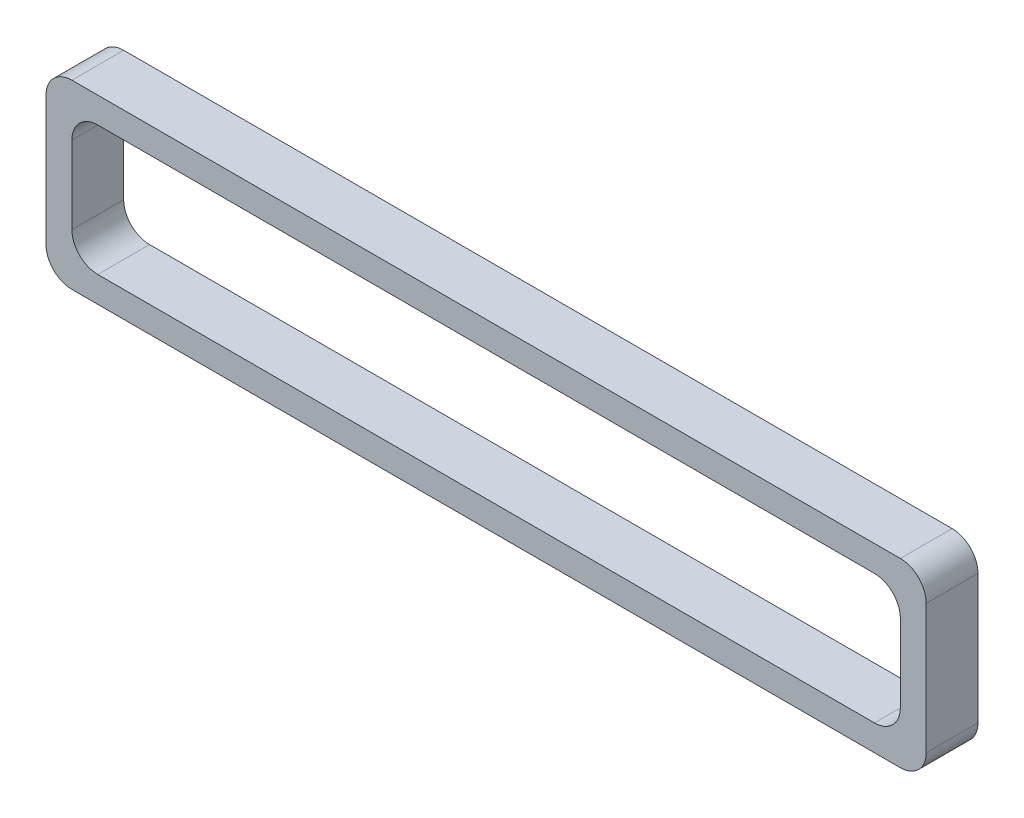
ISO-10303-21;
HEADER;
FILE_DESCRIPTION(('STEP AP214'),'2;1');
FILE_NAME('part.step','',(''),(''),'','','');
FILE_SCHEMA(('AUTOMOTIVE_DESIGN { 1 0 10303 214 1 1 1 1 }'));
ENDSEC;
DATA;
#1=APPLICATION_CONTEXT('core data for automotive mechanical design processes');
#2=APPLICATION_PROTOCOL_DEFINITION('international standard','automotive_design',2000,#1);
#3=PRODUCT_CONTEXT('',#1,'mechanical');
#4=PRODUCT('Part','Part','',(#3));
#5=PRODUCT_RELATED_PRODUCT_CATEGORY('part','',(#4));
#6=PRODUCT_DEFINITION_FORMATION('','',#4);
#7=PRODUCT_DEFINITION_CONTEXT('part definition',#1,'design');
#8=PRODUCT_DEFINITION('design','',#6,#7);
#9=PRODUCT_DEFINITION_SHAPE('','',#8);
#10=(LENGTH_UNIT() NAMED_UNIT(*) SI_UNIT(.MILLI.,.METRE.));
#11=(NAMED_UNIT(*) PLANE_ANGLE_UNIT() SI_UNIT($,.RADIAN.));
#12=(NAMED_UNIT(*) SI_UNIT($,.STERADIAN.) SOLID_ANGLE_UNIT());
#13=UNCERTAINTY_MEASURE_WITH_UNIT(LENGTH_MEASURE(1.E-05),#10,'distance_accuracy_value','');
#14=(GEOMETRIC_REPRESENTATION_CONTEXT(3) GLOBAL_UNCERTAINTY_ASSIGNED_CONTEXT((#13)) GLOBAL_UNIT_ASSIGNED_CONTEXT((#10,
#11,#12)) REPRESENTATION_CONTEXT('',''));
#15=CARTESIAN_POINT('',(0.,0.,0.));
#16=DIRECTION('',(0.,0.,1.));
#17=DIRECTION('',(1.,0.,0.));
#18=AXIS2_PLACEMENT_3D('',#15,#16,#17);
#19=CARTESIAN_POINT('',(16.,-2.5,2.));
#20=DIRECTION('',(0.,0.,1.));
#21=DIRECTION('',(1.,0.,0.));
#22=AXIS2_PLACEMENT_3D('',#19,#20,#21);
#23=PLANE('',#22);
#24=CARTESIAN_POINT('',(16.,-2.5,2.));
#25=DIRECTION('',(0.,0.,1.));
#26=DIRECTION('',(1.,0.,0.));
#27=AXIS2_PLACEMENT_3D('',#24,#25,#26);
#28=CIRCLE('',#27,0.999999999999999);
#29=CARTESIAN_POINT('',(16.,-3.5,2.));
#30=VERTEX_POINT('',#29);
#31=CARTESIAN_POINT('',(17.,-2.5,2.));
#32=VERTEX_POINT('',#31);
#33=EDGE_CURVE('E211',#30,#32,#28,.T.);
#34=ORIENTED_EDGE('',*,*,#33,.T.);
#35=DIRECTION('',(0.,1.,0.));
#36=VECTOR('',#35,1.);
#37=CARTESIAN_POINT('',(17.,2.5,2.));
#38=LINE('',#37,#36);
#39=CARTESIAN_POINT('',(17.,2.5,2.));
#40=VERTEX_POINT('',#39);
#41=EDGE_CURVE('E214',#32,#40,#38,.T.);
#42=ORIENTED_EDGE('',*,*,#41,.T.);
#43=CARTESIAN_POINT('',(16.,2.5,2.));
#44=DIRECTION('',(0.,0.,1.));
#45=DIRECTION('',(-1.,0.,0.));
#46=AXIS2_PLACEMENT_3D('',#43,#44,#45);
#47=CIRCLE('',#46,1.);
#48=CARTESIAN_POINT('',(16.,3.5,2.));
#49=VERTEX_POINT('',#48);
#50=EDGE_CURVE('E217',#40,#49,#47,.T.);
#51=ORIENTED_EDGE('',*,*,#50,.T.);
#52=DIRECTION('',(-1.,0.,0.));
#53=VECTOR('',#52,1.);
#54=CARTESIAN_POINT('',(-16.,3.5,2.));
#55=LINE('',#54,#53);
#56=CARTESIAN_POINT('',(-16.,3.5,2.));
#57=VERTEX_POINT('',#56);
#58=EDGE_CURVE('E219',#49,#57,#55,.T.);
#59=ORIENTED_EDGE('',*,*,#58,.T.);
#60=CARTESIAN_POINT('',(-16.,2.5,2.));
#61=DIRECTION('',(0.,0.,1.));
#62=DIRECTION('',(1.,0.,0.));
#63=AXIS2_PLACEMENT_3D('',#60,#61,#62);
#64=CIRCLE('',#63,1.);
#65=CARTESIAN_POINT('',(-17.,2.5,2.));
#66=VERTEX_POINT('',#65);
#67=EDGE_CURVE('E221',#57,#66,#64,.T.);
#68=ORIENTED_EDGE('',*,*,#67,.T.);
#69=DIRECTION('',(0.,-1.,0.));
#70=VECTOR('',#69,1.);
#71=CARTESIAN_POINT('',(-17.,2.5,2.));
#72=LINE('',#71,#70);
#73=CARTESIAN_POINT('',(-17.,-2.5,2.));
#74=VERTEX_POINT('',#73);
#75=EDGE_CURVE('E223',#66,#74,#72,.T.);
#76=ORIENTED_EDGE('',*,*,#75,.T.);
#77=CARTESIAN_POINT('',(-16.,-2.5,2.));
#78=DIRECTION('',(0.,0.,1.));
#79=DIRECTION('',(1.,0.,0.));
#80=AXIS2_PLACEMENT_3D('',#77,#78,#79);
#81=CIRCLE('',#80,1.);
#82=CARTESIAN_POINT('',(-16.,-3.5,2.));
#83=VERTEX_POINT('',#82);
#84=EDGE_CURVE('E225',#74,#83,#81,.T.);
#85=ORIENTED_EDGE('',*,*,#84,.T.);
#86=DIRECTION('',(1.,0.,0.));
#87=VECTOR('',#86,1.);
#88=CARTESIAN_POINT('',(-16.,-3.5,2.));
#89=LINE('',#88,#87);
#90=EDGE_CURVE('E227',#83,#30,#89,.T.);
#91=ORIENTED_EDGE('',*,*,#90,.T.);
#92=EDGE_LOOP('',(#34,#42,#51,#59,#68,#76,#85,#91));
#93=FACE_BOUND('',#92,.T.);
#94=DIRECTION('',(-1.,0.,0.));
#95=VECTOR('',#94,1.);
#96=CARTESIAN_POINT('',(-15.,2.5,2.));
#97=LINE('',#96,#95);
#98=CARTESIAN_POINT('',(15.,2.5,2.));
#99=VERTEX_POINT('',#98);
#100=CARTESIAN_POINT('',(-15.,2.5,2.));
#101=VERTEX_POINT('',#100);
#102=EDGE_CURVE('E154',#99,#101,#97,.T.);
#103=ORIENTED_EDGE('',*,*,#102,.F.);
#104=CARTESIAN_POINT('',(15.,1.5,2.));
#105=DIRECTION('',(0.,0.,1.));
#106=DIRECTION('',(-1.,0.,0.));
#107=AXIS2_PLACEMENT_3D('',#104,#105,#106);
#108=CIRCLE('',#107,1.);
#109=CARTESIAN_POINT('',(16.,1.5,2.));
#110=VERTEX_POINT('',#109);
#111=EDGE_CURVE('E146',#110,#99,#108,.T.);
#112=ORIENTED_EDGE('',*,*,#111,.F.);
#113=DIRECTION('',(0.,1.,0.));
#114=VECTOR('',#113,1.);
#115=CARTESIAN_POINT('',(16.,1.5,2.));
#116=LINE('',#115,#114);
#117=CARTESIAN_POINT('',(16.,-1.5,2.));
#118=VERTEX_POINT('',#117);
#119=EDGE_CURVE('E179',#118,#110,#116,.T.);
#120=ORIENTED_EDGE('',*,*,#119,.F.);
#121=CARTESIAN_POINT('',(15.,-1.5,2.));
#122=DIRECTION('',(0.,0.,1.));
#123=DIRECTION('',(1.,0.,0.));
#124=AXIS2_PLACEMENT_3D('',#121,#122,#123);
#125=CIRCLE('',#124,0.999999999999999);
#126=CARTESIAN_POINT('',(15.,-2.5,2.));
#127=VERTEX_POINT('',#126);
#128=EDGE_CURVE('E177',#127,#118,#125,.T.);
#129=ORIENTED_EDGE('',*,*,#128,.F.);
#130=DIRECTION('',(1.,0.,0.));
#131=VECTOR('',#130,1.);
#132=CARTESIAN_POINT('',(-15.,-2.5,2.));
#133=LINE('',#132,#131);
#134=CARTESIAN_POINT('',(-15.,-2.5,2.));
#135=VERTEX_POINT('',#134);
#136=EDGE_CURVE('E175',#135,#127,#133,.T.);
#137=ORIENTED_EDGE('',*,*,#136,.F.);
#138=CARTESIAN_POINT('',(-15.,-1.5,2.));
#139=DIRECTION('',(0.,0.,1.));
#140=DIRECTION('',(1.,0.,0.));
#141=AXIS2_PLACEMENT_3D('',#138,#139,#140);
#142=CIRCLE('',#141,0.999999999999999);
#143=CARTESIAN_POINT('',(-16.,-1.5,2.));
#144=VERTEX_POINT('',#143);
#145=EDGE_CURVE('E173',#144,#135,#142,.T.);
#146=ORIENTED_EDGE('',*,*,#145,.F.);
#147=DIRECTION('',(0.,-1.,0.));
#148=VECTOR('',#147,1.);
#149=CARTESIAN_POINT('',(-16.,1.5,2.));
#150=LINE('',#149,#148);
#151=CARTESIAN_POINT('',(-16.,1.5,2.));
#152=VERTEX_POINT('',#151);
#153=EDGE_CURVE('E169',#152,#144,#150,.T.);
#154=ORIENTED_EDGE('',*,*,#153,.F.);
#155=CARTESIAN_POINT('',(-15.,1.5,2.));
#156=DIRECTION('',(0.,0.,1.));
#157=DIRECTION('',(1.,0.,0.));
#158=AXIS2_PLACEMENT_3D('',#155,#156,#157);
#159=CIRCLE('',#158,1.);
#160=EDGE_CURVE('E167',#101,#152,#159,.T.);
#161=ORIENTED_EDGE('',*,*,#160,.F.);
#162=EDGE_LOOP('',(#103,#112,#120,#129,#137,#146,#154,#161));
#163=FACE_BOUND('',#162,.T.);
#164=ADVANCED_FACE('F33',(#93,#163),#23,.T.);
#165=CARTESIAN_POINT('',(16.,-2.5,0.));
#166=DIRECTION('',(0.,0.,1.));
#167=DIRECTION('',(1.,0.,0.));
#168=AXIS2_PLACEMENT_3D('',#165,#166,#167);
#169=PLANE('',#168);
#170=CARTESIAN_POINT('',(16.,-2.5,0.));
#171=DIRECTION('',(0.,0.,1.));
#172=DIRECTION('',(1.,0.,0.));
#173=AXIS2_PLACEMENT_3D('',#170,#171,#172);
#174=CIRCLE('',#173,0.999999999999999);
#175=CARTESIAN_POINT('',(16.,-3.5,0.));
#176=VERTEX_POINT('',#175);
#177=CARTESIAN_POINT('',(17.,-2.5,0.));
#178=VERTEX_POINT('',#177);
#179=EDGE_CURVE('E162',#176,#178,#174,.T.);
#180=ORIENTED_EDGE('',*,*,#179,.F.);
#181=DIRECTION('',(1.,0.,0.));
#182=VECTOR('',#181,1.);
#183=CARTESIAN_POINT('',(-16.,-3.5,0.));
#184=LINE('',#183,#182);
#185=CARTESIAN_POINT('',(-16.,-3.5,0.));
#186=VERTEX_POINT('',#185);
#187=EDGE_CURVE('E215',#186,#176,#184,.T.);
#188=ORIENTED_EDGE('',*,*,#187,.F.);
#189=CARTESIAN_POINT('',(-16.,-2.5,0.));
#190=DIRECTION('',(0.,0.,1.));
#191=DIRECTION('',(1.,0.,0.));
#192=AXIS2_PLACEMENT_3D('',#189,#190,#191);
#193=CIRCLE('',#192,1.);
#194=CARTESIAN_POINT('',(-17.,-2.5,0.));
#195=VERTEX_POINT('',#194);
#196=EDGE_CURVE('E242',#195,#186,#193,.T.);
#197=ORIENTED_EDGE('',*,*,#196,.F.);
#198=DIRECTION('',(0.,-1.,0.));
#199=VECTOR('',#198,1.);
#200=CARTESIAN_POINT('',(-17.,2.5,0.));
#201=LINE('',#200,#199);
#202=CARTESIAN_POINT('',(-17.,2.5,0.));
#203=VERTEX_POINT('',#202);
#204=EDGE_CURVE('E240',#203,#195,#201,.T.);
#205=ORIENTED_EDGE('',*,*,#204,.F.);
#206=CARTESIAN_POINT('',(-16.,2.5,0.));
#207=DIRECTION('',(0.,0.,1.));
#208=DIRECTION('',(1.,0.,0.));
#209=AXIS2_PLACEMENT_3D('',#206,#207,#208);
#210=CIRCLE('',#209,1.);
#211=CARTESIAN_POINT('',(-16.,3.5,0.));
#212=VERTEX_POINT('',#211);
#213=EDGE_CURVE('E238',#212,#203,#210,.T.);
#214=ORIENTED_EDGE('',*,*,#213,.F.);
#215=DIRECTION('',(-1.,0.,0.));
#216=VECTOR('',#215,1.);
#217=CARTESIAN_POINT('',(-16.,3.5,0.));
#218=LINE('',#217,#216);
#219=CARTESIAN_POINT('',(16.,3.5,0.));
#220=VERTEX_POINT('',#219);
#221=EDGE_CURVE('E236',#220,#212,#218,.T.);
#222=ORIENTED_EDGE('',*,*,#221,.F.);
#223=CARTESIAN_POINT('',(16.,2.5,0.));
#224=DIRECTION('',(0.,0.,1.));
#225=DIRECTION('',(-1.,0.,0.));
#226=AXIS2_PLACEMENT_3D('',#223,#224,#225);
#227=CIRCLE('',#226,1.);
#228=CARTESIAN_POINT('',(17.,2.5,0.));
#229=VERTEX_POINT('',#228);
#230=EDGE_CURVE('E234',#229,#220,#227,.T.);
#231=ORIENTED_EDGE('',*,*,#230,.F.);
#232=DIRECTION('',(0.,1.,0.));
#233=VECTOR('',#232,1.);
#234=CARTESIAN_POINT('',(17.,2.5,0.));
#235=LINE('',#234,#233);
#236=EDGE_CURVE('E232',#178,#229,#235,.T.);
#237=ORIENTED_EDGE('',*,*,#236,.F.);
#238=EDGE_LOOP('',(#180,#188,#197,#205,#214,#222,#231,#237));
#239=FACE_BOUND('',#238,.T.);
#240=CARTESIAN_POINT('',(15.,1.5,0.));
#241=DIRECTION('',(0.,0.,1.));
#242=DIRECTION('',(-1.,0.,0.));
#243=AXIS2_PLACEMENT_3D('',#240,#241,#242);
#244=CIRCLE('',#243,1.);
#245=CARTESIAN_POINT('',(16.,1.5,0.));
#246=VERTEX_POINT('',#245);
#247=CARTESIAN_POINT('',(15.,2.5,0.));
#248=VERTEX_POINT('',#247);
#249=EDGE_CURVE('E56',#246,#248,#244,.T.);
#250=ORIENTED_EDGE('',*,*,#249,.T.);
#251=DIRECTION('',(-1.,0.,0.));
#252=VECTOR('',#251,1.);
#253=CARTESIAN_POINT('',(-15.,2.5,0.));
#254=LINE('',#253,#252);
#255=CARTESIAN_POINT('',(-15.,2.5,0.));
#256=VERTEX_POINT('',#255);
#257=EDGE_CURVE('E161',#248,#256,#254,.T.);
#258=ORIENTED_EDGE('',*,*,#257,.T.);
#259=CARTESIAN_POINT('',(-15.,1.5,0.));
#260=DIRECTION('',(0.,0.,1.));
#261=DIRECTION('',(1.,0.,0.));
#262=AXIS2_PLACEMENT_3D('',#259,#260,#261);
#263=CIRCLE('',#262,1.);
#264=CARTESIAN_POINT('',(-16.,1.5,0.));
#265=VERTEX_POINT('',#264);
#266=EDGE_CURVE('E183',#256,#265,#263,.T.);
#267=ORIENTED_EDGE('',*,*,#266,.T.);
#268=DIRECTION('',(0.,-1.,0.));
#269=VECTOR('',#268,1.);
#270=CARTESIAN_POINT('',(-16.,1.5,0.));
#271=LINE('',#270,#269);
#272=CARTESIAN_POINT('',(-16.,-1.5,0.));
#273=VERTEX_POINT('',#272);
#274=EDGE_CURVE('E186',#265,#273,#271,.T.);
#275=ORIENTED_EDGE('',*,*,#274,.T.);
#276=CARTESIAN_POINT('',(-15.,-1.5,0.));
#277=DIRECTION('',(0.,0.,1.));
#278=DIRECTION('',(1.,0.,0.));
#279=AXIS2_PLACEMENT_3D('',#276,#277,#278);
#280=CIRCLE('',#279,0.999999999999999);
#281=CARTESIAN_POINT('',(-15.,-2.5,0.));
#282=VERTEX_POINT('',#281);
#283=EDGE_CURVE('E189',#273,#282,#280,.T.);
#284=ORIENTED_EDGE('',*,*,#283,.T.);
#285=DIRECTION('',(1.,0.,0.));
#286=VECTOR('',#285,1.);
#287=CARTESIAN_POINT('',(-15.,-2.5,0.));
#288=LINE('',#287,#286);
#289=CARTESIAN_POINT('',(15.,-2.5,0.));
#290=VERTEX_POINT('',#289);
#291=EDGE_CURVE('E192',#282,#290,#288,.T.);
#292=ORIENTED_EDGE('',*,*,#291,.T.);
#293=CARTESIAN_POINT('',(15.,-1.5,0.));
#294=DIRECTION('',(0.,0.,1.));
#295=DIRECTION('',(1.,0.,0.));
#296=AXIS2_PLACEMENT_3D('',#293,#294,#295);
#297=CIRCLE('',#296,0.999999999999999);
#298=CARTESIAN_POINT('',(16.,-1.5,0.));
#299=VERTEX_POINT('',#298);
#300=EDGE_CURVE('E195',#290,#299,#297,.T.);
#301=ORIENTED_EDGE('',*,*,#300,.T.);
#302=DIRECTION('',(0.,1.,0.));
#303=VECTOR('',#302,1.);
#304=CARTESIAN_POINT('',(16.,1.5,0.));
#305=LINE('',#304,#303);
#306=EDGE_CURVE('E155',#299,#246,#305,.T.);
#307=ORIENTED_EDGE('',*,*,#306,.T.);
#308=EDGE_LOOP('',(#250,#258,#267,#275,#284,#292,#301,#307));
#309=FACE_BOUND('',#308,.T.);
#310=ADVANCED_FACE('F272',(#239,#309),#169,.F.);
#311=CARTESIAN_POINT('',(16.,-2.5,2.));
#312=DIRECTION('',(0.,0.,-1.));
#313=DIRECTION('',(-1.,0.,0.));
#314=AXIS2_PLACEMENT_3D('',#311,#312,#313);
#315=CYLINDRICAL_SURFACE('',#314,0.999999999999999);
#316=ORIENTED_EDGE('',*,*,#179,.T.);
#317=DIRECTION('',(0.,0.,-1.));
#318=VECTOR('',#317,1.);
#319=CARTESIAN_POINT('',(17.,-2.5,2.));
#320=LINE('',#319,#318);
#321=EDGE_CURVE('E11',#32,#178,#320,.T.);
#322=ORIENTED_EDGE('',*,*,#321,.F.);
#323=ORIENTED_EDGE('',*,*,#33,.F.);
#324=DIRECTION('',(0.,0.,-1.));
#325=VECTOR('',#324,1.);
#326=CARTESIAN_POINT('',(16.,-3.5,2.));
#327=LINE('',#326,#325);
#328=EDGE_CURVE('E229',#30,#176,#327,.T.);
#329=ORIENTED_EDGE('',*,*,#328,.T.);
#330=EDGE_LOOP('',(#316,#322,#323,#329));
#331=FACE_BOUND('',#330,.T.);
#332=ADVANCED_FACE('F35',(#331),#315,.T.);
#333=CARTESIAN_POINT('',(17.,2.5,2.));
#334=DIRECTION('',(-1.,0.,0.));
#335=DIRECTION('',(0.,0.,1.));
#336=AXIS2_PLACEMENT_3D('',#333,#334,#335);
#337=PLANE('',#336);
#338=ORIENTED_EDGE('',*,*,#236,.T.);
#339=DIRECTION('',(0.,0.,-1.));
#340=VECTOR('',#339,1.);
#341=CARTESIAN_POINT('',(17.,2.5,2.));
#342=LINE('',#341,#340);
#343=EDGE_CURVE('E41',#40,#229,#342,.T.);
#344=ORIENTED_EDGE('',*,*,#343,.F.);
#345=ORIENTED_EDGE('',*,*,#41,.F.);
#346=ORIENTED_EDGE('',*,*,#321,.T.);
#347=EDGE_LOOP('',(#338,#344,#345,#346));
#348=FACE_BOUND('',#347,.T.);
#349=ADVANCED_FACE('F289',(#348),#337,.F.);
#350=CARTESIAN_POINT('',(16.,2.5,2.));
#351=DIRECTION('',(0.,0.,-1.));
#352=DIRECTION('',(-1.,0.,0.));
#353=AXIS2_PLACEMENT_3D('',#350,#351,#352);
#354=CYLINDRICAL_SURFACE('',#353,1.);
#355=ORIENTED_EDGE('',*,*,#230,.T.);
#356=DIRECTION('',(0.,0.,-1.));
#357=VECTOR('',#356,1.);
#358=CARTESIAN_POINT('',(16.,3.5,2.));
#359=LINE('',#358,#357);
#360=EDGE_CURVE('E259',#49,#220,#359,.T.);
#361=ORIENTED_EDGE('',*,*,#360,.F.);
#362=ORIENTED_EDGE('',*,*,#50,.F.);
#363=ORIENTED_EDGE('',*,*,#343,.T.);
#364=EDGE_LOOP('',(#355,#361,#362,#363));
#365=FACE_BOUND('',#364,.T.);
#366=ADVANCED_FACE('F266',(#365),#354,.T.);
#367=CARTESIAN_POINT('',(-16.,3.5,2.));
#368=DIRECTION('',(0.,-1.,0.));
#369=DIRECTION('',(0.,0.,-1.));
#370=AXIS2_PLACEMENT_3D('',#367,#368,#369);
#371=PLANE('',#370);
#372=ORIENTED_EDGE('',*,*,#221,.T.);
#373=DIRECTION('',(0.,0.,-1.));
#374=VECTOR('',#373,1.);
#375=CARTESIAN_POINT('',(-16.,3.5,2.));
#376=LINE('',#375,#374);
#377=EDGE_CURVE('E256',#57,#212,#376,.T.);
#378=ORIENTED_EDGE('',*,*,#377,.F.);
#379=ORIENTED_EDGE('',*,*,#58,.F.);
#380=ORIENTED_EDGE('',*,*,#360,.T.);
#381=EDGE_LOOP('',(#372,#378,#379,#380));
#382=FACE_BOUND('',#381,.T.);
#383=ADVANCED_FACE('F278',(#382),#371,.F.);
#384=CARTESIAN_POINT('',(-16.,2.5,2.));
#385=DIRECTION('',(0.,0.,-1.));
#386=DIRECTION('',(-1.,0.,0.));
#387=AXIS2_PLACEMENT_3D('',#384,#385,#386);
#388=CYLINDRICAL_SURFACE('',#387,1.);
#389=ORIENTED_EDGE('',*,*,#213,.T.);
#390=DIRECTION('',(0.,0.,-1.));
#391=VECTOR('',#390,1.);
#392=CARTESIAN_POINT('',(-17.,2.5,2.));
#393=LINE('',#392,#391);
#394=EDGE_CURVE('E253',#66,#203,#393,.T.);
#395=ORIENTED_EDGE('',*,*,#394,.F.);
#396=ORIENTED_EDGE('',*,*,#67,.F.);
#397=ORIENTED_EDGE('',*,*,#377,.T.);
#398=EDGE_LOOP('',(#389,#395,#396,#397));
#399=FACE_BOUND('',#398,.T.);
#400=ADVANCED_FACE('F282',(#399),#388,.T.);
#401=CARTESIAN_POINT('',(-17.,2.5,2.));
#402=DIRECTION('',(1.,0.,0.));
#403=DIRECTION('',(0.,0.,-1.));
#404=AXIS2_PLACEMENT_3D('',#401,#402,#403);
#405=PLANE('',#404);
#406=ORIENTED_EDGE('',*,*,#204,.T.);
#407=DIRECTION('',(0.,0.,-1.));
#408=VECTOR('',#407,1.);
#409=CARTESIAN_POINT('',(-17.,-2.5,2.));
#410=LINE('',#409,#408);
#411=EDGE_CURVE('E250',#74,#195,#410,.T.);
#412=ORIENTED_EDGE('',*,*,#411,.F.);
#413=ORIENTED_EDGE('',*,*,#75,.F.);
#414=ORIENTED_EDGE('',*,*,#394,.T.);
#415=EDGE_LOOP('',(#406,#412,#413,#414));
#416=FACE_BOUND('',#415,.T.);
#417=ADVANCED_FACE('F302',(#416),#405,.F.);
#418=CARTESIAN_POINT('',(-16.,-2.5,2.));
#419=DIRECTION('',(0.,0.,-1.));
#420=DIRECTION('',(-1.,0.,0.));
#421=AXIS2_PLACEMENT_3D('',#418,#419,#420);
#422=CYLINDRICAL_SURFACE('',#421,1.);
#423=ORIENTED_EDGE('',*,*,#196,.T.);
#424=DIRECTION('',(0.,0.,-1.));
#425=VECTOR('',#424,1.);
#426=CARTESIAN_POINT('',(-16.,-3.5,2.));
#427=LINE('',#426,#425);
#428=EDGE_CURVE('E247',#83,#186,#427,.T.);
#429=ORIENTED_EDGE('',*,*,#428,.F.);
#430=ORIENTED_EDGE('',*,*,#84,.F.);
#431=ORIENTED_EDGE('',*,*,#411,.T.);
#432=EDGE_LOOP('',(#423,#429,#430,#431));
#433=FACE_BOUND('',#432,.T.);
#434=ADVANCED_FACE('F300',(#433),#422,.T.);
#435=CARTESIAN_POINT('',(-16.,-3.5,2.));
#436=DIRECTION('',(0.,1.,0.));
#437=DIRECTION('',(0.,0.,1.));
#438=AXIS2_PLACEMENT_3D('',#435,#436,#437);
#439=PLANE('',#438);
#440=ORIENTED_EDGE('',*,*,#187,.T.);
#441=ORIENTED_EDGE('',*,*,#328,.F.);
#442=ORIENTED_EDGE('',*,*,#90,.F.);
#443=ORIENTED_EDGE('',*,*,#428,.T.);
#444=EDGE_LOOP('',(#440,#441,#442,#443));
#445=FACE_BOUND('',#444,.T.);
#446=ADVANCED_FACE('F295',(#445),#439,.F.);
#447=CARTESIAN_POINT('',(15.,1.5,2.));
#448=DIRECTION('',(0.,0.,-1.));
#449=DIRECTION('',(-1.,0.,0.));
#450=AXIS2_PLACEMENT_3D('',#447,#448,#449);
#451=CYLINDRICAL_SURFACE('',#450,1.);
#452=ORIENTED_EDGE('',*,*,#249,.F.);
#453=DIRECTION('',(0.,0.,-1.));
#454=VECTOR('',#453,1.);
#455=CARTESIAN_POINT('',(16.,1.5,2.));
#456=LINE('',#455,#454);
#457=EDGE_CURVE('E150',#110,#246,#456,.T.);
#458=ORIENTED_EDGE('',*,*,#457,.F.);
#459=ORIENTED_EDGE('',*,*,#111,.T.);
#460=DIRECTION('',(0.,0.,-1.));
#461=VECTOR('',#460,1.);
#462=CARTESIAN_POINT('',(15.,2.5,2.));
#463=LINE('',#462,#461);
#464=EDGE_CURVE('E149',#99,#248,#463,.T.);
#465=ORIENTED_EDGE('',*,*,#464,.T.);
#466=EDGE_LOOP('',(#452,#458,#459,#465));
#467=FACE_BOUND('',#466,.T.);
#468=ADVANCED_FACE('F148',(#467),#451,.F.);
#469=CARTESIAN_POINT('',(-15.,2.5,2.));
#470=DIRECTION('',(0.,-1.,0.));
#471=DIRECTION('',(1.,0.,0.));
#472=AXIS2_PLACEMENT_3D('',#469,#470,#471);
#473=PLANE('',#472);
#474=ORIENTED_EDGE('',*,*,#257,.F.);
#475=ORIENTED_EDGE('',*,*,#464,.F.);
#476=ORIENTED_EDGE('',*,*,#102,.T.);
#477=DIRECTION('',(0.,0.,-1.));
#478=VECTOR('',#477,1.);
#479=CARTESIAN_POINT('',(-15.,2.5,2.));
#480=LINE('',#479,#478);
#481=EDGE_CURVE('E163',#101,#256,#480,.T.);
#482=ORIENTED_EDGE('',*,*,#481,.T.);
#483=EDGE_LOOP('',(#474,#475,#476,#482));
#484=FACE_BOUND('',#483,.T.);
#485=ADVANCED_FACE('F158',(#484),#473,.T.);
#486=CARTESIAN_POINT('',(-15.,1.5,2.));
#487=DIRECTION('',(0.,0.,-1.));
#488=DIRECTION('',(-1.,0.,0.));
#489=AXIS2_PLACEMENT_3D('',#486,#487,#488);
#490=CYLINDRICAL_SURFACE('',#489,1.);
#491=ORIENTED_EDGE('',*,*,#266,.F.);
#492=ORIENTED_EDGE('',*,*,#481,.F.);
#493=ORIENTED_EDGE('',*,*,#160,.T.);
#494=DIRECTION('',(0.,0.,-1.));
#495=VECTOR('',#494,1.);
#496=CARTESIAN_POINT('',(-16.,1.5,2.));
#497=LINE('',#496,#495);
#498=EDGE_CURVE('E208',#152,#265,#497,.T.);
#499=ORIENTED_EDGE('',*,*,#498,.T.);
#500=EDGE_LOOP('',(#491,#492,#493,#499));
#501=FACE_BOUND('',#500,.T.);
#502=ADVANCED_FACE('F327',(#501),#490,.F.);
#503=CARTESIAN_POINT('',(-16.,1.5,2.));
#504=DIRECTION('',(1.,0.,0.));
#505=DIRECTION('',(0.,0.,-1.));
#506=AXIS2_PLACEMENT_3D('',#503,#504,#505);
#507=PLANE('',#506);
#508=ORIENTED_EDGE('',*,*,#274,.F.);
#509=ORIENTED_EDGE('',*,*,#498,.F.);
#510=ORIENTED_EDGE('',*,*,#153,.T.);
#511=DIRECTION('',(0.,0.,-1.));
#512=VECTOR('',#511,1.);
#513=CARTESIAN_POINT('',(-16.,-1.5,2.));
#514=LINE('',#513,#512);
#515=EDGE_CURVE('E206',#144,#273,#514,.T.);
#516=ORIENTED_EDGE('',*,*,#515,.T.);
#517=EDGE_LOOP('',(#508,#509,#510,#516));
#518=FACE_BOUND('',#517,.T.);
#519=ADVANCED_FACE('F331',(#518),#507,.T.);
#520=CARTESIAN_POINT('',(-15.,-1.5,2.));
#521=DIRECTION('',(0.,0.,-1.));
#522=DIRECTION('',(-1.,0.,0.));
#523=AXIS2_PLACEMENT_3D('',#520,#521,#522);
#524=CYLINDRICAL_SURFACE('',#523,0.999999999999999);
#525=ORIENTED_EDGE('',*,*,#283,.F.);
#526=ORIENTED_EDGE('',*,*,#515,.F.);
#527=ORIENTED_EDGE('',*,*,#145,.T.);
#528=DIRECTION('',(0.,0.,-1.));
#529=VECTOR('',#528,1.);
#530=CARTESIAN_POINT('',(-15.,-2.5,2.));
#531=LINE('',#530,#529);
#532=EDGE_CURVE('E204',#135,#282,#531,.T.);
#533=ORIENTED_EDGE('',*,*,#532,.T.);
#534=EDGE_LOOP('',(#525,#526,#527,#533));
#535=FACE_BOUND('',#534,.T.);
#536=ADVANCED_FACE('F337',(#535),#524,.F.);
#537=CARTESIAN_POINT('',(-15.,-2.5,2.));
#538=DIRECTION('',(0.,1.,0.));
#539=DIRECTION('',(0.,0.,1.));
#540=AXIS2_PLACEMENT_3D('',#537,#538,#539);
#541=PLANE('',#540);
#542=ORIENTED_EDGE('',*,*,#291,.F.);
#543=ORIENTED_EDGE('',*,*,#532,.F.);
#544=ORIENTED_EDGE('',*,*,#136,.T.);
#545=DIRECTION('',(0.,0.,-1.));
#546=VECTOR('',#545,1.);
#547=CARTESIAN_POINT('',(15.,-2.5,2.));
#548=LINE('',#547,#546);
#549=EDGE_CURVE('E202',#127,#290,#548,.T.);
#550=ORIENTED_EDGE('',*,*,#549,.T.);
#551=EDGE_LOOP('',(#542,#543,#544,#550));
#552=FACE_BOUND('',#551,.T.);
#553=ADVANCED_FACE('F341',(#552),#541,.T.);
#554=CARTESIAN_POINT('',(15.,-1.5,2.));
#555=DIRECTION('',(0.,0.,-1.));
#556=DIRECTION('',(-1.,0.,0.));
#557=AXIS2_PLACEMENT_3D('',#554,#555,#556);
#558=CYLINDRICAL_SURFACE('',#557,0.999999999999999);
#559=ORIENTED_EDGE('',*,*,#300,.F.);
#560=ORIENTED_EDGE('',*,*,#549,.F.);
#561=ORIENTED_EDGE('',*,*,#128,.T.);
#562=DIRECTION('',(0.,0.,-1.));
#563=VECTOR('',#562,1.);
#564=CARTESIAN_POINT('',(16.,-1.5,2.));
#565=LINE('',#564,#563);
#566=EDGE_CURVE('E48',#118,#299,#565,.T.);
#567=ORIENTED_EDGE('',*,*,#566,.T.);
#568=EDGE_LOOP('',(#559,#560,#561,#567));
#569=FACE_BOUND('',#568,.T.);
#570=ADVANCED_FACE('F345',(#569),#558,.F.);
#571=CARTESIAN_POINT('',(16.,1.5,2.));
#572=DIRECTION('',(-1.,0.,0.));
#573=DIRECTION('',(0.,0.,1.));
#574=AXIS2_PLACEMENT_3D('',#571,#572,#573);
#575=PLANE('',#574);
#576=ORIENTED_EDGE('',*,*,#306,.F.);
#577=ORIENTED_EDGE('',*,*,#566,.F.);
#578=ORIENTED_EDGE('',*,*,#119,.T.);
#579=ORIENTED_EDGE('',*,*,#457,.T.);
#580=EDGE_LOOP('',(#576,#577,#578,#579));
#581=FACE_BOUND('',#580,.T.);
#582=ADVANCED_FACE('F349',(#581),#575,.T.);
#583=CLOSED_SHELL('',(#164,#310,#332,#349,#366,#383,#400,#417,#434,#446,#468,#485,#502,#519,
#536,#553,#570,#582));
#584=MANIFOLD_SOLID_BREP('B2',#583);
#585=ADVANCED_BREP_SHAPE_REPRESENTATION('',(#18,#584),#14);
#586=SHAPE_DEFINITION_REPRESENTATION(#9,#585);
ENDSEC;
END-ISO-10303-21;
